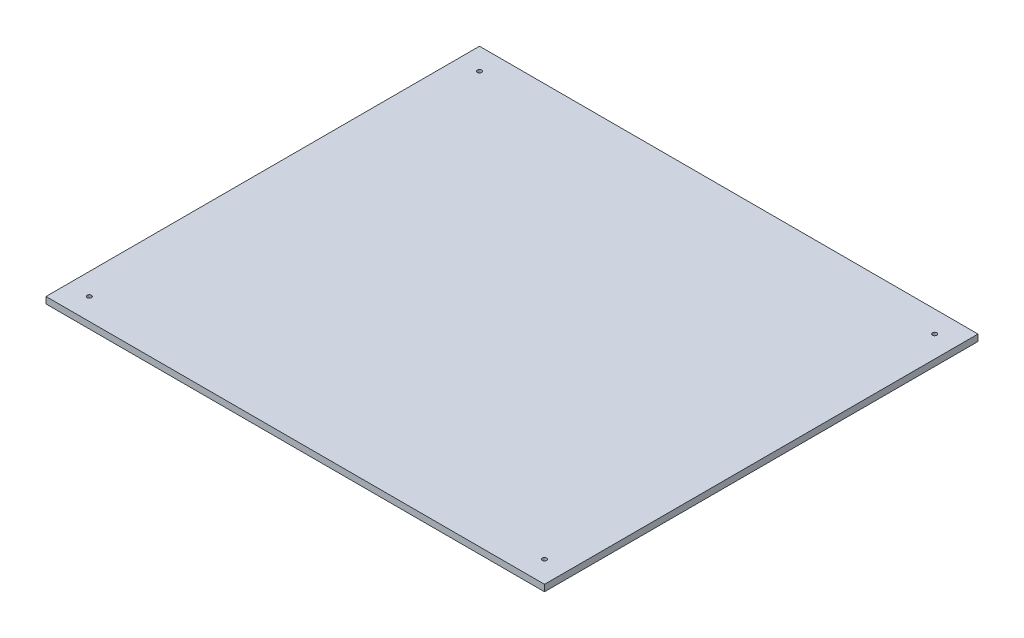
ISO-10303-21;
HEADER;
FILE_DESCRIPTION(('STEP AP214'),'2;1');
FILE_NAME('part.step','',(''),(''),'','','');
FILE_SCHEMA(('AUTOMOTIVE_DESIGN { 1 0 10303 214 1 1 1 1 }'));
ENDSEC;
DATA;
#1=APPLICATION_CONTEXT('core data for automotive mechanical design processes');
#2=APPLICATION_PROTOCOL_DEFINITION('international standard','automotive_design',2000,#1);
#3=PRODUCT_CONTEXT('',#1,'mechanical');
#4=PRODUCT('Part','Part','',(#3));
#5=PRODUCT_RELATED_PRODUCT_CATEGORY('part','',(#4));
#6=PRODUCT_DEFINITION_FORMATION('','',#4);
#7=PRODUCT_DEFINITION_CONTEXT('part definition',#1,'design');
#8=PRODUCT_DEFINITION('design','',#6,#7);
#9=PRODUCT_DEFINITION_SHAPE('','',#8);
#10=(LENGTH_UNIT() NAMED_UNIT(*) SI_UNIT(.MILLI.,.METRE.));
#11=(NAMED_UNIT(*) PLANE_ANGLE_UNIT() SI_UNIT($,.RADIAN.));
#12=(NAMED_UNIT(*) SI_UNIT($,.STERADIAN.) SOLID_ANGLE_UNIT());
#13=UNCERTAINTY_MEASURE_WITH_UNIT(LENGTH_MEASURE(1.E-05),#10,'distance_accuracy_value','');
#14=(GEOMETRIC_REPRESENTATION_CONTEXT(3) GLOBAL_UNCERTAINTY_ASSIGNED_CONTEXT((#13)) GLOBAL_UNIT_ASSIGNED_CONTEXT((#10,
#11,#12)) REPRESENTATION_CONTEXT('',''));
#15=CARTESIAN_POINT('',(0.,0.,0.));
#16=DIRECTION('',(0.,0.,1.));
#17=DIRECTION('',(1.,0.,0.));
#18=AXIS2_PLACEMENT_3D('',#15,#16,#17);
#19=CARTESIAN_POINT('',(0.,3.,0.));
#20=DIRECTION('',(0.,1.,0.));
#21=DIRECTION('',(0.,0.,1.));
#22=AXIS2_PLACEMENT_3D('',#19,#20,#21);
#23=PLANE('',#22);
#24=CARTESIAN_POINT('',(105.,3.,89.9999999999999));
#25=DIRECTION('',(0.,1.,0.));
#26=DIRECTION('',(0.,0.,1.));
#27=AXIS2_PLACEMENT_3D('',#24,#25,#26);
#28=CIRCLE('',#27,0.999999999999998);
#29=CARTESIAN_POINT('',(105.,3.,90.9999999999999));
#30=VERTEX_POINT('',#29);
#31=EDGE_CURVE('E146',#30,#30,#28,.T.);
#32=ORIENTED_EDGE('',*,*,#31,.F.);
#33=EDGE_LOOP('',(#32));
#34=FACE_BOUND('',#33,.T.);
#35=CARTESIAN_POINT('',(105.,3.,-89.9999999999999));
#36=DIRECTION('',(0.,1.,0.));
#37=DIRECTION('',(0.,0.,-1.));
#38=AXIS2_PLACEMENT_3D('',#35,#36,#37);
#39=CIRCLE('',#38,0.999999999999998);
#40=CARTESIAN_POINT('',(105.,3.,-90.9999999999999));
#41=VERTEX_POINT('',#40);
#42=EDGE_CURVE('E116',#41,#41,#39,.T.);
#43=ORIENTED_EDGE('',*,*,#42,.F.);
#44=EDGE_LOOP('',(#43));
#45=FACE_BOUND('',#44,.T.);
#46=DIRECTION('',(0.,0.,1.));
#47=VECTOR('',#46,1.);
#48=CARTESIAN_POINT('',(-115.,3.,-100.));
#49=LINE('',#48,#47);
#50=CARTESIAN_POINT('',(-115.,3.,-100.));
#51=VERTEX_POINT('',#50);
#52=CARTESIAN_POINT('',(-115.,3.,99.9999999999999));
#53=VERTEX_POINT('',#52);
#54=EDGE_CURVE('E96',#51,#53,#49,.T.);
#55=ORIENTED_EDGE('',*,*,#54,.T.);
#56=DIRECTION('',(1.,0.,0.));
#57=VECTOR('',#56,1.);
#58=CARTESIAN_POINT('',(-115.,3.,99.9999999999999));
#59=LINE('',#58,#57);
#60=CARTESIAN_POINT('',(115.,3.,99.9999999999999));
#61=VERTEX_POINT('',#60);
#62=EDGE_CURVE('E91',#53,#61,#59,.T.);
#63=ORIENTED_EDGE('',*,*,#62,.T.);
#64=DIRECTION('',(0.,0.,-1.));
#65=VECTOR('',#64,1.);
#66=CARTESIAN_POINT('',(115.,3.,-100.));
#67=LINE('',#66,#65);
#68=CARTESIAN_POINT('',(115.,3.,-100.));
#69=VERTEX_POINT('',#68);
#70=EDGE_CURVE('E94',#61,#69,#67,.T.);
#71=ORIENTED_EDGE('',*,*,#70,.T.);
#72=DIRECTION('',(-1.,0.,0.));
#73=VECTOR('',#72,1.);
#74=CARTESIAN_POINT('',(-115.,3.,-100.));
#75=LINE('',#74,#73);
#76=EDGE_CURVE('E61',#69,#51,#75,.T.);
#77=ORIENTED_EDGE('',*,*,#76,.T.);
#78=EDGE_LOOP('',(#55,#63,#71,#77));
#79=FACE_BOUND('',#78,.T.);
#80=CARTESIAN_POINT('',(-105.,3.,-90.));
#81=DIRECTION('',(0.,1.,0.));
#82=DIRECTION('',(0.,0.,1.));
#83=AXIS2_PLACEMENT_3D('',#80,#81,#82);
#84=CIRCLE('',#83,0.999999999999998);
#85=CARTESIAN_POINT('',(-105.,3.,-89.));
#86=VERTEX_POINT('',#85);
#87=EDGE_CURVE('E138',#86,#86,#84,.T.);
#88=ORIENTED_EDGE('',*,*,#87,.F.);
#89=EDGE_LOOP('',(#88));
#90=FACE_BOUND('',#89,.T.);
#91=CARTESIAN_POINT('',(-105.,3.,90.));
#92=DIRECTION('',(0.,1.,0.));
#93=DIRECTION('',(0.,0.,-1.));
#94=AXIS2_PLACEMENT_3D('',#91,#92,#93);
#95=CIRCLE('',#94,0.999999999999998);
#96=CARTESIAN_POINT('',(-105.,3.,89.));
#97=VERTEX_POINT('',#96);
#98=EDGE_CURVE('E154',#97,#97,#95,.T.);
#99=ORIENTED_EDGE('',*,*,#98,.F.);
#100=EDGE_LOOP('',(#99));
#101=FACE_BOUND('',#100,.T.);
#102=ADVANCED_FACE('F43',(#34,#45,#79,#90,#101),#23,.T.);
#103=CARTESIAN_POINT('',(0.,0.,0.));
#104=DIRECTION('',(0.,1.,0.));
#105=DIRECTION('',(0.,0.,1.));
#106=AXIS2_PLACEMENT_3D('',#103,#104,#105);
#107=PLANE('',#106);
#108=DIRECTION('',(0.,0.,1.));
#109=VECTOR('',#108,1.);
#110=CARTESIAN_POINT('',(-115.,0.,-100.));
#111=LINE('',#110,#109);
#112=CARTESIAN_POINT('',(-115.,0.,-100.));
#113=VERTEX_POINT('',#112);
#114=CARTESIAN_POINT('',(-115.,0.,99.9999999999999));
#115=VERTEX_POINT('',#114);
#116=EDGE_CURVE('E112',#113,#115,#111,.T.);
#117=ORIENTED_EDGE('',*,*,#116,.F.);
#118=DIRECTION('',(-1.,0.,0.));
#119=VECTOR('',#118,1.);
#120=CARTESIAN_POINT('',(-115.,0.,-100.));
#121=LINE('',#120,#119);
#122=CARTESIAN_POINT('',(115.,0.,-100.));
#123=VERTEX_POINT('',#122);
#124=EDGE_CURVE('E84',#123,#113,#121,.T.);
#125=ORIENTED_EDGE('',*,*,#124,.F.);
#126=DIRECTION('',(0.,0.,-1.));
#127=VECTOR('',#126,1.);
#128=CARTESIAN_POINT('',(115.,0.,-100.));
#129=LINE('',#128,#127);
#130=CARTESIAN_POINT('',(115.,0.,99.9999999999999));
#131=VERTEX_POINT('',#130);
#132=EDGE_CURVE('E78',#131,#123,#129,.T.);
#133=ORIENTED_EDGE('',*,*,#132,.F.);
#134=DIRECTION('',(1.,0.,0.));
#135=VECTOR('',#134,1.);
#136=CARTESIAN_POINT('',(-115.,0.,99.9999999999999));
#137=LINE('',#136,#135);
#138=EDGE_CURVE('E101',#115,#131,#137,.T.);
#139=ORIENTED_EDGE('',*,*,#138,.F.);
#140=EDGE_LOOP('',(#117,#125,#133,#139));
#141=FACE_BOUND('',#140,.T.);
#142=CARTESIAN_POINT('',(105.,0.,-89.9999999999999));
#143=DIRECTION('',(0.,1.,0.));
#144=DIRECTION('',(0.,0.,-1.));
#145=AXIS2_PLACEMENT_3D('',#142,#143,#144);
#146=CIRCLE('',#145,0.999999999999998);
#147=CARTESIAN_POINT('',(105.,0.,-90.9999999999999));
#148=VERTEX_POINT('',#147);
#149=EDGE_CURVE('E134',#148,#148,#146,.T.);
#150=ORIENTED_EDGE('',*,*,#149,.T.);
#151=EDGE_LOOP('',(#150));
#152=FACE_BOUND('',#151,.T.);
#153=CARTESIAN_POINT('',(-105.,0.,-90.));
#154=DIRECTION('',(0.,1.,0.));
#155=DIRECTION('',(0.,0.,1.));
#156=AXIS2_PLACEMENT_3D('',#153,#154,#155);
#157=CIRCLE('',#156,0.999999999999998);
#158=CARTESIAN_POINT('',(-105.,0.,-89.));
#159=VERTEX_POINT('',#158);
#160=EDGE_CURVE('E142',#159,#159,#157,.T.);
#161=ORIENTED_EDGE('',*,*,#160,.T.);
#162=EDGE_LOOP('',(#161));
#163=FACE_BOUND('',#162,.T.);
#164=CARTESIAN_POINT('',(105.,0.,89.9999999999999));
#165=DIRECTION('',(0.,1.,0.));
#166=DIRECTION('',(0.,0.,1.));
#167=AXIS2_PLACEMENT_3D('',#164,#165,#166);
#168=CIRCLE('',#167,0.999999999999998);
#169=CARTESIAN_POINT('',(105.,0.,90.9999999999999));
#170=VERTEX_POINT('',#169);
#171=EDGE_CURVE('E150',#170,#170,#168,.T.);
#172=ORIENTED_EDGE('',*,*,#171,.T.);
#173=EDGE_LOOP('',(#172));
#174=FACE_BOUND('',#173,.T.);
#175=CARTESIAN_POINT('',(-105.,0.,90.));
#176=DIRECTION('',(0.,1.,0.));
#177=DIRECTION('',(0.,0.,-1.));
#178=AXIS2_PLACEMENT_3D('',#175,#176,#177);
#179=CIRCLE('',#178,0.999999999999998);
#180=CARTESIAN_POINT('',(-105.,0.,89.));
#181=VERTEX_POINT('',#180);
#182=EDGE_CURVE('E158',#181,#181,#179,.T.);
#183=ORIENTED_EDGE('',*,*,#182,.T.);
#184=EDGE_LOOP('',(#183));
#185=FACE_BOUND('',#184,.T.);
#186=ADVANCED_FACE('F129',(#141,#152,#163,#174,#185),#107,.F.);
#187=CARTESIAN_POINT('',(-115.,3.,-100.));
#188=DIRECTION('',(1.,0.,0.));
#189=DIRECTION('',(0.,0.,-1.));
#190=AXIS2_PLACEMENT_3D('',#187,#188,#189);
#191=PLANE('',#190);
#192=ORIENTED_EDGE('',*,*,#116,.T.);
#193=DIRECTION('',(0.,-1.,0.));
#194=VECTOR('',#193,1.);
#195=CARTESIAN_POINT('',(-115.,3.,99.9999999999999));
#196=LINE('',#195,#194);
#197=EDGE_CURVE('E11',#53,#115,#196,.T.);
#198=ORIENTED_EDGE('',*,*,#197,.F.);
#199=ORIENTED_EDGE('',*,*,#54,.F.);
#200=DIRECTION('',(0.,-1.,0.));
#201=VECTOR('',#200,1.);
#202=CARTESIAN_POINT('',(-115.,3.,-100.));
#203=LINE('',#202,#201);
#204=EDGE_CURVE('E108',#51,#113,#203,.T.);
#205=ORIENTED_EDGE('',*,*,#204,.T.);
#206=EDGE_LOOP('',(#192,#198,#199,#205));
#207=FACE_BOUND('',#206,.T.);
#208=ADVANCED_FACE('F45',(#207),#191,.F.);
#209=CARTESIAN_POINT('',(-115.,3.,99.9999999999999));
#210=DIRECTION('',(0.,0.,-1.));
#211=DIRECTION('',(-1.,0.,0.));
#212=AXIS2_PLACEMENT_3D('',#209,#210,#211);
#213=PLANE('',#212);
#214=ORIENTED_EDGE('',*,*,#138,.T.);
#215=DIRECTION('',(0.,-1.,0.));
#216=VECTOR('',#215,1.);
#217=CARTESIAN_POINT('',(115.,3.,99.9999999999999));
#218=LINE('',#217,#216);
#219=EDGE_CURVE('E53',#61,#131,#218,.T.);
#220=ORIENTED_EDGE('',*,*,#219,.F.);
#221=ORIENTED_EDGE('',*,*,#62,.F.);
#222=ORIENTED_EDGE('',*,*,#197,.T.);
#223=EDGE_LOOP('',(#214,#220,#221,#222));
#224=FACE_BOUND('',#223,.T.);
#225=ADVANCED_FACE('F100',(#224),#213,.F.);
#226=CARTESIAN_POINT('',(115.,3.,-100.));
#227=DIRECTION('',(-1.,0.,0.));
#228=DIRECTION('',(0.,0.,1.));
#229=AXIS2_PLACEMENT_3D('',#226,#227,#228);
#230=PLANE('',#229);
#231=ORIENTED_EDGE('',*,*,#132,.T.);
#232=DIRECTION('',(0.,-1.,0.));
#233=VECTOR('',#232,1.);
#234=CARTESIAN_POINT('',(115.,3.,-100.));
#235=LINE('',#234,#233);
#236=EDGE_CURVE('E103',#69,#123,#235,.T.);
#237=ORIENTED_EDGE('',*,*,#236,.F.);
#238=ORIENTED_EDGE('',*,*,#70,.F.);
#239=ORIENTED_EDGE('',*,*,#219,.T.);
#240=EDGE_LOOP('',(#231,#237,#238,#239));
#241=FACE_BOUND('',#240,.T.);
#242=ADVANCED_FACE('F104',(#241),#230,.F.);
#243=CARTESIAN_POINT('',(-115.,3.,-100.));
#244=DIRECTION('',(0.,0.,1.));
#245=DIRECTION('',(1.,0.,0.));
#246=AXIS2_PLACEMENT_3D('',#243,#244,#245);
#247=PLANE('',#246);
#248=ORIENTED_EDGE('',*,*,#124,.T.);
#249=ORIENTED_EDGE('',*,*,#204,.F.);
#250=ORIENTED_EDGE('',*,*,#76,.F.);
#251=ORIENTED_EDGE('',*,*,#236,.T.);
#252=EDGE_LOOP('',(#248,#249,#250,#251));
#253=FACE_BOUND('',#252,.T.);
#254=ADVANCED_FACE('F126',(#253),#247,.F.);
#255=CARTESIAN_POINT('',(105.,3.,-89.9999999999999));
#256=DIRECTION('',(0.,-1.,0.));
#257=DIRECTION('',(0.,0.,-1.));
#258=AXIS2_PLACEMENT_3D('',#255,#256,#257);
#259=CYLINDRICAL_SURFACE('',#258,0.999999999999998);
#260=ORIENTED_EDGE('',*,*,#42,.T.);
#261=EDGE_LOOP('',(#260));
#262=FACE_BOUND('',#261,.T.);
#263=ORIENTED_EDGE('',*,*,#149,.F.);
#264=EDGE_LOOP('',(#263));
#265=FACE_BOUND('',#264,.T.);
#266=ADVANCED_FACE('F179',(#262,#265),#259,.F.);
#267=CARTESIAN_POINT('',(-105.,3.,-90.));
#268=DIRECTION('',(0.,-1.,0.));
#269=DIRECTION('',(0.,0.,-1.));
#270=AXIS2_PLACEMENT_3D('',#267,#268,#269);
#271=CYLINDRICAL_SURFACE('',#270,0.999999999999998);
#272=ORIENTED_EDGE('',*,*,#87,.T.);
#273=EDGE_LOOP('',(#272));
#274=FACE_BOUND('',#273,.T.);
#275=ORIENTED_EDGE('',*,*,#160,.F.);
#276=EDGE_LOOP('',(#275));
#277=FACE_BOUND('',#276,.T.);
#278=ADVANCED_FACE('F233',(#274,#277),#271,.F.);
#279=CARTESIAN_POINT('',(105.,3.,89.9999999999999));
#280=DIRECTION('',(0.,-1.,0.));
#281=DIRECTION('',(0.,0.,-1.));
#282=AXIS2_PLACEMENT_3D('',#279,#280,#281);
#283=CYLINDRICAL_SURFACE('',#282,0.999999999999998);
#284=ORIENTED_EDGE('',*,*,#31,.T.);
#285=EDGE_LOOP('',(#284));
#286=FACE_BOUND('',#285,.T.);
#287=ORIENTED_EDGE('',*,*,#171,.F.);
#288=EDGE_LOOP('',(#287));
#289=FACE_BOUND('',#288,.T.);
#290=ADVANCED_FACE('F242',(#286,#289),#283,.F.);
#291=CARTESIAN_POINT('',(-105.,3.,90.));
#292=DIRECTION('',(0.,-1.,0.));
#293=DIRECTION('',(0.,0.,-1.));
#294=AXIS2_PLACEMENT_3D('',#291,#292,#293);
#295=CYLINDRICAL_SURFACE('',#294,0.999999999999998);
#296=ORIENTED_EDGE('',*,*,#98,.T.);
#297=EDGE_LOOP('',(#296));
#298=FACE_BOUND('',#297,.T.);
#299=ORIENTED_EDGE('',*,*,#182,.F.);
#300=EDGE_LOOP('',(#299));
#301=FACE_BOUND('',#300,.T.);
#302=ADVANCED_FACE('F166',(#298,#301),#295,.F.);
#303=CLOSED_SHELL('',(#102,#186,#208,#225,#242,#254,#266,#278,#290,#302));
#304=MANIFOLD_SOLID_BREP('B2',#303);
#305=ADVANCED_BREP_SHAPE_REPRESENTATION('',(#18,#304),#14);
#306=SHAPE_DEFINITION_REPRESENTATION(#9,#305);
ENDSEC;
END-ISO-10303-21;
